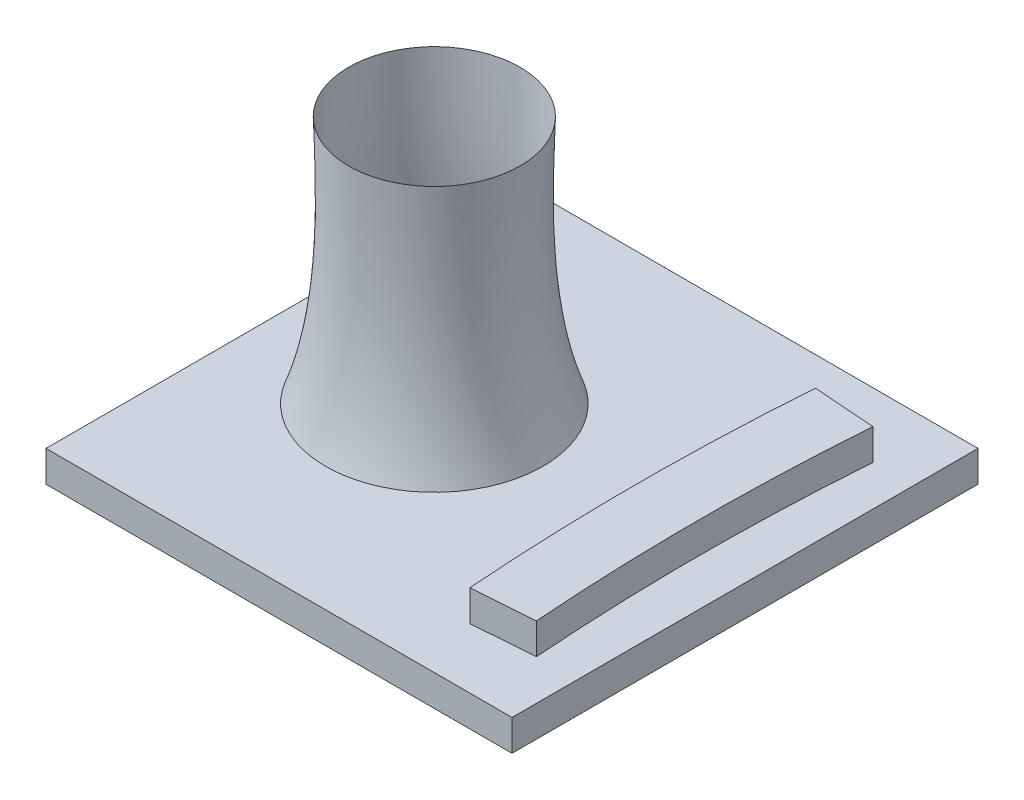
ISO-10303-21;
HEADER;
FILE_DESCRIPTION(('STEP AP214'),'2;1');
FILE_NAME('part.step','',(''),(''),'','','');
FILE_SCHEMA(('AUTOMOTIVE_DESIGN { 1 0 10303 214 1 1 1 1 }'));
ENDSEC;
DATA;
#1=APPLICATION_CONTEXT('core data for automotive mechanical design processes');
#2=APPLICATION_PROTOCOL_DEFINITION('international standard','automotive_design',2000,#1);
#3=PRODUCT_CONTEXT('',#1,'mechanical');
#4=PRODUCT('Part','Part','',(#3));
#5=PRODUCT_RELATED_PRODUCT_CATEGORY('part','',(#4));
#6=PRODUCT_DEFINITION_FORMATION('','',#4);
#7=PRODUCT_DEFINITION_CONTEXT('part definition',#1,'design');
#8=PRODUCT_DEFINITION('design','',#6,#7);
#9=PRODUCT_DEFINITION_SHAPE('','',#8);
#10=(LENGTH_UNIT() NAMED_UNIT(*) SI_UNIT(.MILLI.,.METRE.));
#11=(NAMED_UNIT(*) PLANE_ANGLE_UNIT() SI_UNIT($,.RADIAN.));
#12=(NAMED_UNIT(*) SI_UNIT($,.STERADIAN.) SOLID_ANGLE_UNIT());
#13=UNCERTAINTY_MEASURE_WITH_UNIT(LENGTH_MEASURE(1.E-05),#10,'distance_accuracy_value','');
#14=(GEOMETRIC_REPRESENTATION_CONTEXT(3) GLOBAL_UNCERTAINTY_ASSIGNED_CONTEXT((#13)) GLOBAL_UNIT_ASSIGNED_CONTEXT((#10,
#11,#12)) REPRESENTATION_CONTEXT('',''));
#15=CARTESIAN_POINT('',(0.,0.,0.));
#16=DIRECTION('',(0.,0.,1.));
#17=DIRECTION('',(1.,0.,0.));
#18=AXIS2_PLACEMENT_3D('',#15,#16,#17);
#19=CARTESIAN_POINT('',(50.,-10.,26.7834159771898));
#20=CARTESIAN_POINT('',(51.5360446831811,-3.89289577495572,34.0913470207165));
#21=CARTESIAN_POINT('',(52.5810938065248,25.4400049682429,48.805802062785));
#22=CARTESIAN_POINT('',(47.9107082583191,62.7737708917109,48.2171206091628));
#23=CARTESIAN_POINT('',(44.5619953627069,90.,47.9720763598593));
#24=CARTESIAN_POINT('',(46.844232146284,-10.,26.7834159771898));
#25=CARTESIAN_POINT('',(48.8585760484344,-3.89289579445962,33.9908139188959));
#26=CARTESIAN_POINT('',(50.8666940744463,25.440005003867,48.6368682931955));
#27=CARTESIAN_POINT('',(46.1577718719543,62.773770872207,48.3538662657232));
#28=CARTESIAN_POINT('',(42.7930220041651,90.,48.3279929095388));
#29=CARTESIAN_POINT('',(40.5327779805231,-10.,27.4048734473123));
#30=CARTESIAN_POINT('',(43.4839231096477,-3.89289848514892,34.3170065041225));
#31=CARTESIAN_POINT('',(47.4046507284485,25.4400099184445,48.6366061058294));
#32=CARTESIAN_POINT('',(42.6788817092925,62.7737681815177,48.9725332870656));
#33=CARTESIAN_POINT('',(39.3252176794973,89.9999999999998,49.3881643586702));
#34=CARTESIAN_POINT('',(31.4292845887339,-9.99999999999999,30.1664619918307));
#35=CARTESIAN_POINT('',(35.6722326883418,-3.89289967521169,36.3700416132635));
#36=CARTESIAN_POINT('',(42.31128798345,25.440012092109,49.6495922482934));
#37=CARTESIAN_POINT('',(37.7418559556166,62.7737669914551,50.9010063925906));
#38=CARTESIAN_POINT('',(34.5337190074696,90.0000000000004,51.962908963358));
#39=CARTESIAN_POINT('',(23.039558872965,-10.,34.6508586032685));
#40=CARTESIAN_POINT('',(28.4112154194457,-3.89289764991089,39.9074737062787));
#41=CARTESIAN_POINT('',(37.5133712534784,25.4400083928719,51.6366355915534));
#42=CARTESIAN_POINT('',(33.2758946890674,62.7737690167555,53.75546436725));
#43=CARTESIAN_POINT('',(30.3365779065963,89.9999999999994,55.4228446476357));
#44=CARTESIAN_POINT('',(15.6858666315459,-9.99999999999998,40.6858908945665));
#45=CARTESIAN_POINT('',(21.9798171690793,-3.89289959248465,44.7935686192731));
#46=CARTESIAN_POINT('',(33.1953171064472,25.440011941007,54.5216553999407));
#47=CARTESIAN_POINT('',(29.4526328783662,62.7737670741823,57.4264320282639));
#48=CARTESIAN_POINT('',(26.8950901608575,90.0000000000005,59.6351859938754));
#49=CARTESIAN_POINT('',(9.65085929320404,-10.,48.0395660532391));
#50=CARTESIAN_POINT('',(16.6252389719306,-3.89289737662122,50.8404080061829));
#51=CARTESIAN_POINT('',(29.5230823290591,25.4400078937049,58.1935137012388));
#52=CARTESIAN_POINT('',(26.4190017526858,62.7737692900451,61.7726775317442));
#53=CARTESIAN_POINT('',(24.3415034736129,89.9999999999995,64.4379703453799));
#54=CARTESIAN_POINT('',(5.16643584446719,-9.99999999999998,56.4293338688709));
#55=CARTESIAN_POINT('',(12.5532271274709,-3.89289829450224,57.8157278671272));
#56=CARTESIAN_POINT('',(26.6377721204681,25.440009570226,62.5113092205069));
#57=CARTESIAN_POINT('',(24.291593009661,62.7737683721646,66.6272767601216));
#58=CARTESIAN_POINT('',(22.7739846652669,90.0000000000004,69.6466572073446));
#59=CARTESIAN_POINT('',(2.40494429460202,-10.,65.5327535925535));
#60=CARTESIAN_POINT('',(9.92027166608392,-3.89289775499006,65.4514110555797));
#61=CARTESIAN_POINT('',(24.6502446204235,25.4400085848002,67.3089972929252));
#62=CARTESIAN_POINT('',(23.1521285611798,62.7737689116766,71.8035944731931));
#63=CARTESIAN_POINT('',(22.2527296379119,89.9999999999998,75.0610287192464));
#64=CARTESIAN_POINT('',(1.47250105450267,-10.,75.0000009005685));
#65=CARTESIAN_POINT('',(8.82755604516029,-3.89289815652996,73.4540511275151));
#66=CARTESIAN_POINT('',(23.636897460767,25.4400093182179,72.402263235385));
#67=CARTESIAN_POINT('',(23.0444191253954,62.7737685101369,77.1027640726562));
#68=CARTESIAN_POINT('',(22.7977956746769,90.0000000000002,80.473070318207));
#69=CARTESIAN_POINT('',(2.404944013433,-9.99999999999997,84.4672442491685));
#70=CARTESIAN_POINT('',(9.31707233897168,-3.89289781872243,81.5160976486671));
#71=CARTESIAN_POINT('',(23.6366582963666,25.4400087012083,77.5953566798255));
#72=CARTESIAN_POINT('',(23.9725843657939,62.7737688479441,82.3211253291737));
#73=CARTESIAN_POINT('',(24.3882120537142,89.9999999999999,85.6747857699478));
#74=CARTESIAN_POINT('',(5.16643651190207,-10.,93.5706694875571));
#75=CARTESIAN_POINT('',(11.3700109994957,-3.89289850136981,89.3277319043863));
#76=CARTESIAN_POINT('',(24.6495528352567,25.4400099480721,82.6886992730676));
#77=CARTESIAN_POINT('',(25.9009727694369,62.7737681652969,87.2581272068164));
#78=CARTESIAN_POINT('',(26.9628791668011,89.9999999999999,90.466262441197));
#79=CARTESIAN_POINT('',(9.65085799379323,-9.99999999999997,101.960428128512));
#80=CARTESIAN_POINT('',(14.9074717643047,-3.89289733438174,96.5887657423897));
#81=CARTESIAN_POINT('',(26.6366319656263,25.4400078165539,87.4866025735215));
#82=CARTESIAN_POINT('',(28.7554643548777,62.7737693322849,91.7240906755667));
#83=CARTESIAN_POINT('',(30.4228468796561,90.,94.6634155282791));
#84=CARTESIAN_POINT('',(15.6858690372599,-10.,109.314119531787));
#85=CARTESIAN_POINT('',(19.793518935168,-3.89289864126559,103.020135330356));
#86=CARTESIAN_POINT('',(29.5215692270281,25.4400102035937,91.8045916340506));
#87=CARTESIAN_POINT('',(32.4263939121902,62.773768025401,95.5473301269909));
#88=CARTESIAN_POINT('',(34.6351815027923,89.9999999999999,98.1049117267386));
#89=CARTESIAN_POINT('',(23.0395544345749,-9.99999999999998,115.349122310322));
#90=CARTESIAN_POINT('',(25.8403906665526,-3.89289706314234,108.374740760142));
#91=CARTESIAN_POINT('',(33.1934890830532,25.4400073211317,95.4768971403605));
#92=CARTESIAN_POINT('',(36.7726631789656,62.7737696035244,98.5809848030841));
#93=CARTESIAN_POINT('',(39.4379632031947,90.0000000000001,100.658488374736));
#94=CARTESIAN_POINT('',(31.4292933006047,-10.,119.833575607584));
#95=CARTESIAN_POINT('',(32.815699243417,-3.89290006293595,112.446774037515));
#96=CARTESIAN_POINT('',(37.5113027573094,25.4400128002923,98.3622114243815));
#97=CARTESIAN_POINT('',(41.6272621232999,62.7737666037306,100.708402536365));
#98=CARTESIAN_POINT('',(44.646637620429,89.9999999999999,102.226018355859));
#99=CARTESIAN_POINT('',(40.5327596344421,-9.99999999999997,122.595044920215));
#100=CARTESIAN_POINT('',(40.4514141183767,-3.89289670614299,115.079724537252));
#101=CARTESIAN_POINT('',(42.3089948318256,25.440006669068,100.349764161435));
#102=CARTESIAN_POINT('',(46.8035947380186,62.7737699605237,101.84787361086));
#103=CARTESIAN_POINT('',(50.0610305639051,90.0000000000001,102.747268530628));
#104=CARTESIAN_POINT('',(50.,-10.,123.527505943413));
#105=CARTESIAN_POINT('',(48.4540504348366,-3.89289891888131,116.172445498858));
#106=CARTESIAN_POINT('',(47.4022631077869,25.4400107106622,101.363094324242));
#107=CARTESIAN_POINT('',(52.1027636910204,62.7737677477855,101.955577954968));
#108=CARTESIAN_POINT('',(55.4730698842755,90.,102.202204627577));
#109=CARTESIAN_POINT('',(59.4672403655581,-9.99999999999998,122.595044920215));
#110=CARTESIAN_POINT('',(56.5160964047866,-3.89289680921488,115.682923569284));
#111=CARTESIAN_POINT('',(52.5953596775332,25.4400068573301,101.363350399451));
#112=CARTESIAN_POINT('',(57.3211258127139,62.7737698574517,101.027418011497));
#113=CARTESIAN_POINT('',(60.6747844774491,90.,100.611786583534));
#114=CARTESIAN_POINT('',(68.5707066993954,-10.,119.833575607584));
#115=CARTESIAN_POINT('',(64.3277579651942,-3.89290014616978,113.629992501524));
#116=CARTESIAN_POINT('',(57.6887053262633,25.4400129523198,100.350433631502));
#117=CARTESIAN_POINT('',(62.2581400886502,62.7737665204972,99.0990199682804));
#118=CARTESIAN_POINT('',(65.4662798845794,90.0000000000003,98.037116807718));
#119=CARTESIAN_POINT('',(76.960445565425,-9.99999999999997,115.349122310322));
#120=CARTESIAN_POINT('',(71.5887892917945,-3.89289748405628,110.092508773163));
#121=CARTESIAN_POINT('',(62.4866325360016,25.4400080899364,98.3633503714723));
#122=CARTESIAN_POINT('',(66.7241073771749,62.7737691826102,96.2445213217684));
#123=CARTESIAN_POINT('',(69.6634226934954,89.9999999999997,94.577141133231));
#124=CARTESIAN_POINT('',(84.3141309627403,-10.,109.314119531786));
#125=CARTESIAN_POINT('',(78.0201806272083,-3.89289974812967,105.206439793423));
#126=CARTESIAN_POINT('',(66.8046814923628,25.4400122252946,95.4783494646189));
#127=CARTESIAN_POINT('',(70.5473663371014,62.7737669185372,92.5735746416984));
#128=CARTESIAN_POINT('',(73.1049095275809,90.0000000000003,90.3648218041995));
#129=CARTESIAN_POINT('',(90.3491420062064,-9.99999999999996,101.960428128513));
#130=CARTESIAN_POINT('',(83.3747621835483,-3.89289730195224,99.1595874071178));
#131=CARTESIAN_POINT('',(70.4769183795616,25.440007757321,91.8064838728521));
#132=CARTESIAN_POINT('',(73.5809986180815,62.7737693647143,88.2273190235765));
#133=CARTESIAN_POINT('',(75.6584966580028,89.9999999999999,85.5620255531993));
#134=CARTESIAN_POINT('',(94.8335634880985,-10.0000000000001,93.570669487557));
#135=CARTESIAN_POINT('',(87.4467722724628,-3.89289832248762,92.1842747915974));
#136=CARTESIAN_POINT('',(73.3622275046518,25.4400096213416,87.488692137968));
#137=CARTESIAN_POINT('',(75.7084068283874,62.773768344179,83.3727249576722));
#138=CARTESIAN_POINT('',(77.2260153219984,89.9999999999999,80.3533447366744));
#139=CARTESIAN_POINT('',(97.5950559865664,-9.99999999999995,84.4672442491686));
#140=CARTESIAN_POINT('',(90.0797286076632,-3.8928977458714,84.5485872308226));
#141=CARTESIAN_POINT('',(75.3497555721623,25.440008568145,82.6910018312185));
#142=CARTESIAN_POINT('',(76.8478714747875,62.7737689207953,78.1964044653809));
#143=CARTESIAN_POINT('',(77.7472702872052,90.0000000000001,74.9389701009866));
#144=CARTESIAN_POINT('',(98.5274989454977,-10.0000000000001,75.0000009005688));
#145=CARTESIAN_POINT('',(91.1724439032431,-3.89289815799269,76.545950308323));
#146=CARTESIAN_POINT('',(76.3631024536139,25.4400093208895,77.5977375059417));
#147=CARTESIAN_POINT('',(76.9555809505671,62.773768508674,72.8972367964183));
#148=CARTESIAN_POINT('',(77.2022045166622,90.,69.5269306327849));
#149=CARTESIAN_POINT('',(97.5950557053978,-9.99999999999997,65.5327535925535));
#150=CARTESIAN_POINT('',(90.6829275114112,-3.89289782411876,68.483900623601));
#151=CARTESIAN_POINT('',(76.3633417158851,25.4400087110649,72.4046424182934));
#152=CARTESIAN_POINT('',(76.0274154143068,62.7737688425477,67.6788736374973));
#153=CARTESIAN_POINT('',(75.6117875590751,89.9999999999999,64.3252131131251));
#154=CARTESIAN_POINT('',(94.8335641555333,-10.,56.4293338688712));
#155=CARTESIAN_POINT('',(88.6299894042075,-3.89289848073982,60.6722707872873));
#156=CARTESIAN_POINT('',(75.3504472224857,25.4400099103911,67.3113021493428));
#157=CARTESIAN_POINT('',(74.0990276967141,62.773768185927,62.7418744384469));
#158=CARTESIAN_POINT('',(73.0371215967787,90.0000000000002,59.5337393466285));
#159=CARTESIAN_POINT('',(90.3491407067958,-10.,48.0395660532392));
#160=CARTESIAN_POINT('',(85.0925274429175,-3.89289738357706,53.4112296054721));
#161=CARTESIAN_POINT('',(73.3633678734158,25.4400079064099,62.513394869176));
#162=CARTESIAN_POINT('',(71.2445345864195,62.7737692830894,58.2759060660736));
#163=CARTESIAN_POINT('',(69.5771514127728,89.9999999999998,55.3365807403427));
#164=CARTESIAN_POINT('',(84.3141333684543,-10.,40.6858908945666));
#165=CARTESIAN_POINT('',(80.2064825811949,-3.89289853040258,46.9798732040335));
#166=CARTESIAN_POINT('',(70.478431153,25.4400100011008,58.1954134977783));
#167=CARTESIAN_POINT('',(67.5736081793982,62.7737681362642,54.4526761609073));
#168=CARTESIAN_POINT('',(65.3648218003779,90.0000000000001,51.8950953440544));
#169=CARTESIAN_POINT('',(76.9604411270351,-9.99999999999999,34.6508586032685));
#170=CARTESIAN_POINT('',(74.1596060967756,-3.89289722323844,41.6252414541534));
#171=CARTESIAN_POINT('',(66.8065094920364,25.4400076135494,54.523088207768));
#172=CARTESIAN_POINT('',(63.2273325943886,62.7737694434282,51.4190015836739));
#173=CARTESIAN_POINT('',(60.5620307442557,89.9999999999999,49.3414987446389));
#174=CARTESIAN_POINT('',(68.5707154112661,-10.,30.1664619918307));
#175=CARTESIAN_POINT('',(67.1843073030505,-3.89289958714321,37.5532604849489));
#176=CARTESIAN_POINT('',(62.4886994379756,25.4400119312507,51.637815820798));
#177=CARTESIAN_POINT('',(58.3727456194864,62.7737670795235,49.2916223463608));
#178=CARTESIAN_POINT('',(55.3533733680963,90.0000000000002,47.7740049814119));
#179=CARTESIAN_POINT('',(59.4672220194768,-10.,27.4048734473122));
#180=CARTESIAN_POINT('',(59.5485718347857,-3.89289836812552,34.9202051150464));
#181=CARTESIAN_POINT('',(57.6910033022145,25.4400097046999,49.6501889795312));
#182=CARTESIAN_POINT('',(53.1963906709522,62.7737682985411,48.1520813501818));
#183=CARTESIAN_POINT('',(49.9389484742196,89.9999999999999,47.2526870630719));
#184=CARTESIAN_POINT('',(53.155767853716,-10.,26.7834159771898));
#185=CARTESIAN_POINT('',(54.2135133179278,-3.89289575545182,34.1918801225372));
#186=CARTESIAN_POINT('',(54.2954935386032,25.4400049326188,48.9747358323746));
#187=CARTESIAN_POINT('',(49.6636446446838,62.7737709112148,48.0803749526024));
#188=CARTESIAN_POINT('',(46.3309687212488,90.,47.6161598101799));
#189=CARTESIAN_POINT('',(50.,-10.,26.7834159771898));
#190=CARTESIAN_POINT('',(51.5360446831811,-3.89289577495572,34.0913470207165));
#191=CARTESIAN_POINT('',(52.5810938065248,25.4400049682429,48.805802062785));
#192=CARTESIAN_POINT('',(47.9107082583191,62.7737708917109,48.2171206091628));
#193=CARTESIAN_POINT('',(44.5619953627069,90.,47.9720763598593));
#194=B_SPLINE_SURFACE_WITH_KNOTS('',3,3,((#19,#20,#21,#22,#23),(#24,#25,#26,#27,#28),(#29,#30,
#31,#32,#33),(#34,#35,#36,#37,#38),(#39,#40,#41,#42,#43),(#44,#45,#46,#47,#48),(#49,#50,#51,#52,
#53),(#54,#55,#56,#57,#58),(#59,#60,#61,#62,#63),(#64,#65,#66,#67,#68),(#69,#70,#71,#72,#73),
(#74,#75,#76,#77,#78),(#79,#80,#81,#82,#83),(#84,#85,#86,#87,#88),(#89,#90,#91,#92,#93),(#94,
#95,#96,#97,#98),(#99,#100,#101,#102,#103),(#104,#105,#106,#107,#108),(#109,#110,#111,#112,
#113),(#114,#115,#116,#117,#118),(#119,#120,#121,#122,#123),(#124,#125,#126,#127,#128),(#129,
#130,#131,#132,#133),(#134,#135,#136,#137,#138),(#139,#140,#141,#142,#143),(#144,#145,#146,#147,
#148),(#149,#150,#151,#152,#153),(#154,#155,#156,#157,#158),(#159,#160,#161,#162,#163),(#164,
#165,#166,#167,#168),(#169,#170,#171,#172,#173),(#174,#175,#176,#177,#178),(#179,#180,#181,#182,
#183),(#184,#185,#186,#187,#188),(#189,#190,#191,#192,#193)),.UNSPECIFIED.,.T.,.F.,.F.,(4,1,1,1,
1,1,1,1,1,1,1,1,1,1,1,1,1,1,1,1,1,1,1,1,1,1,1,1,1,1,1,1,4),(4,1,4),(0.,0.03125,0.0625,0.09375,
0.125,0.15625,0.1875,0.21875,0.25,0.28125,0.3125,0.34375,0.375,0.40625,0.4375,0.46875,0.5,
0.53125,0.5625,0.59375,0.625,0.65625,0.6875,0.71875,0.75,0.78125,0.8125,0.84375,0.875,0.90625,
0.9375,0.96875,1.),(0.,0.229623305502749,1.),.UNSPECIFIED.);
#195=CARTESIAN_POINT('',(50.,-10.,26.7834159771898));
#196=CARTESIAN_POINT('',(46.844232146284,-10.,26.7834159771898));
#197=CARTESIAN_POINT('',(40.5327779805231,-10.,27.4048734473123));
#198=CARTESIAN_POINT('',(31.4292845887339,-9.99999999999999,30.1664619918307));
#199=CARTESIAN_POINT('',(23.039558872965,-10.,34.6508586032685));
#200=CARTESIAN_POINT('',(15.6858666315459,-9.99999999999998,40.6858908945665));
#201=CARTESIAN_POINT('',(9.65085929320404,-10.,48.0395660532391));
#202=CARTESIAN_POINT('',(5.16643584446719,-9.99999999999998,56.4293338688709));
#203=CARTESIAN_POINT('',(2.40494429460202,-10.,65.5327535925535));
#204=CARTESIAN_POINT('',(1.47250105450267,-10.,75.0000009005685));
#205=CARTESIAN_POINT('',(2.404944013433,-9.99999999999997,84.4672442491685));
#206=CARTESIAN_POINT('',(5.16643651190207,-10.,93.5706694875571));
#207=CARTESIAN_POINT('',(9.65085799379323,-9.99999999999997,101.960428128512));
#208=CARTESIAN_POINT('',(15.6858690372599,-10.,109.314119531787));
#209=CARTESIAN_POINT('',(23.0395544345749,-9.99999999999998,115.349122310322));
#210=CARTESIAN_POINT('',(31.4292933006047,-10.,119.833575607584));
#211=CARTESIAN_POINT('',(40.5327596344421,-9.99999999999997,122.595044920215));
#212=CARTESIAN_POINT('',(50.,-10.,123.527505943413));
#213=CARTESIAN_POINT('',(59.4672403655581,-9.99999999999998,122.595044920215));
#214=CARTESIAN_POINT('',(68.5707066993954,-10.,119.833575607584));
#215=CARTESIAN_POINT('',(76.960445565425,-9.99999999999997,115.349122310322));
#216=CARTESIAN_POINT('',(84.3141309627403,-10.,109.314119531786));
#217=CARTESIAN_POINT('',(90.3491420062064,-9.99999999999996,101.960428128513));
#218=CARTESIAN_POINT('',(94.8335634880985,-10.0000000000001,93.570669487557));
#219=CARTESIAN_POINT('',(97.5950559865664,-9.99999999999995,84.4672442491686));
#220=CARTESIAN_POINT('',(98.5274989454977,-10.0000000000001,75.0000009005688));
#221=CARTESIAN_POINT('',(97.5950557053978,-9.99999999999997,65.5327535925535));
#222=CARTESIAN_POINT('',(94.8335641555333,-10.,56.4293338688712));
#223=CARTESIAN_POINT('',(90.3491407067958,-10.,48.0395660532392));
#224=CARTESIAN_POINT('',(84.3141333684543,-10.,40.6858908945666));
#225=CARTESIAN_POINT('',(76.9604411270351,-9.99999999999999,34.6508586032685));
#226=CARTESIAN_POINT('',(68.5707154112661,-10.,30.1664619918307));
#227=CARTESIAN_POINT('',(59.4672220194768,-10.,27.4048734473122));
#228=CARTESIAN_POINT('',(53.155767853716,-10.,26.7834159771898));
#229=CARTESIAN_POINT('',(50.,-10.,26.7834159771898));
#230=B_SPLINE_CURVE_WITH_KNOTS('',3,(#195,#196,#197,#198,#199,#200,#201,#202,#203,#204,#205,
#206,#207,#208,#209,#210,#211,#212,#213,#214,#215,#216,#217,#218,#219,#220,#221,#222,#223,#224,
#225,#226,#227,#228,#229),.UNSPECIFIED.,.T.,.F.,(4,1,1,1,1,1,1,1,1,1,1,1,1,1,1,1,1,1,1,1,1,1,1,
1,1,1,1,1,1,1,1,1,4),(0.,0.03125,0.0625,0.09375,0.125,0.15625,0.1875,0.21875,0.25,0.28125,
0.3125,0.34375,0.375,0.40625,0.4375,0.46875,0.5,0.53125,0.5625,0.59375,0.625,0.65625,0.6875,
0.71875,0.75,0.78125,0.8125,0.84375,0.875,0.90625,0.9375,0.96875,1.),.UNSPECIFIED.);
#231=CARTESIAN_POINT('',(50.,-10.,26.7834159771898));
#232=VERTEX_POINT('',#231);
#233=EDGE_CURVE('E12',#232,#232,#230,.T.);
#234=CARTESIAN_POINT('',(44.5619953627069,90.,47.9720763598593));
#235=CARTESIAN_POINT('',(42.7930220041651,90.,48.3279929095388));
#236=CARTESIAN_POINT('',(39.3252176794973,89.9999999999998,49.3881643586702));
#237=CARTESIAN_POINT('',(34.5337190074696,90.0000000000004,51.962908963358));
#238=CARTESIAN_POINT('',(30.3365779065963,89.9999999999994,55.4228446476357));
#239=CARTESIAN_POINT('',(26.8950901608575,90.0000000000005,59.6351859938754));
#240=CARTESIAN_POINT('',(24.3415034736129,89.9999999999995,64.4379703453799));
#241=CARTESIAN_POINT('',(22.7739846652669,90.0000000000004,69.6466572073446));
#242=CARTESIAN_POINT('',(22.2527296379119,89.9999999999998,75.0610287192464));
#243=CARTESIAN_POINT('',(22.7977956746769,90.0000000000002,80.473070318207));
#244=CARTESIAN_POINT('',(24.3882120537142,89.9999999999999,85.6747857699478));
#245=CARTESIAN_POINT('',(26.9628791668011,89.9999999999999,90.466262441197));
#246=CARTESIAN_POINT('',(30.4228468796561,90.,94.6634155282791));
#247=CARTESIAN_POINT('',(34.6351815027923,89.9999999999999,98.1049117267386));
#248=CARTESIAN_POINT('',(39.4379632031947,90.0000000000001,100.658488374736));
#249=CARTESIAN_POINT('',(44.646637620429,89.9999999999999,102.226018355859));
#250=CARTESIAN_POINT('',(50.0610305639051,90.0000000000001,102.747268530628));
#251=CARTESIAN_POINT('',(55.4730698842755,90.,102.202204627577));
#252=CARTESIAN_POINT('',(60.6747844774491,90.,100.611786583534));
#253=CARTESIAN_POINT('',(65.4662798845794,90.0000000000003,98.037116807718));
#254=CARTESIAN_POINT('',(69.6634226934954,89.9999999999997,94.577141133231));
#255=CARTESIAN_POINT('',(73.1049095275809,90.0000000000003,90.3648218041995));
#256=CARTESIAN_POINT('',(75.6584966580028,89.9999999999999,85.5620255531993));
#257=CARTESIAN_POINT('',(77.2260153219984,89.9999999999999,80.3533447366744));
#258=CARTESIAN_POINT('',(77.7472702872052,90.0000000000001,74.9389701009866));
#259=CARTESIAN_POINT('',(77.2022045166622,90.,69.5269306327849));
#260=CARTESIAN_POINT('',(75.6117875590751,89.9999999999999,64.3252131131251));
#261=CARTESIAN_POINT('',(73.0371215967787,90.0000000000002,59.5337393466285));
#262=CARTESIAN_POINT('',(69.5771514127728,89.9999999999998,55.3365807403427));
#263=CARTESIAN_POINT('',(65.3648218003779,90.0000000000001,51.8950953440544));
#264=CARTESIAN_POINT('',(60.5620307442557,89.9999999999999,49.3414987446389));
#265=CARTESIAN_POINT('',(55.3533733680963,90.0000000000002,47.7740049814119));
#266=CARTESIAN_POINT('',(49.9389484742196,89.9999999999999,47.2526870630719));
#267=CARTESIAN_POINT('',(46.3309687212488,90.,47.6161598101799));
#268=CARTESIAN_POINT('',(44.5619953627069,90.,47.9720763598593));
#269=B_SPLINE_CURVE_WITH_KNOTS('',3,(#234,#235,#236,#237,#238,#239,#240,#241,#242,#243,#244,
#245,#246,#247,#248,#249,#250,#251,#252,#253,#254,#255,#256,#257,#258,#259,#260,#261,#262,#263,
#264,#265,#266,#267,#268),.UNSPECIFIED.,.T.,.F.,(4,1,1,1,1,1,1,1,1,1,1,1,1,1,1,1,1,1,1,1,1,1,1,
1,1,1,1,1,1,1,1,1,4),(0.,0.03125,0.0625,0.09375,0.125,0.15625,0.1875,0.21875,0.25,0.28125,
0.3125,0.34375,0.375,0.40625,0.4375,0.46875,0.5,0.53125,0.5625,0.59375,0.625,0.65625,0.6875,
0.71875,0.75,0.78125,0.8125,0.84375,0.875,0.90625,0.9375,0.96875,1.),.UNSPECIFIED.);
#270=CARTESIAN_POINT('',(44.5619953627069,90.,47.9720763598593));
#271=VERTEX_POINT('',#270);
#272=EDGE_CURVE('E111',#271,#271,#269,.F.);
#273=ORIENTED_EDGE('',*,*,#233,.T.);
#274=EDGE_LOOP('',(#273));
#275=FACE_BOUND('',#274,.T.);
#276=ORIENTED_EDGE('',*,*,#272,.T.);
#277=EDGE_LOOP('',(#276));
#278=FACE_BOUND('',#277,.T.);
#279=ADVANCED_FACE('F108',(#275,#278),#194,.T.);
#280=OPEN_SHELL('',(#279));
#281=SHELL_BASED_SURFACE_MODEL('B2',(#280));
#282=CARTESIAN_POINT('',(0.,10.,0.));
#283=DIRECTION('',(0.,1.,0.));
#284=DIRECTION('',(0.,0.,1.));
#285=AXIS2_PLACEMENT_3D('',#282,#283,#284);
#286=PLANE('',#285);
#287=DIRECTION('',(0.,0.,1.));
#288=VECTOR('',#287,1.);
#289=CARTESIAN_POINT('',(0.,10.,0.));
#290=LINE('',#289,#288);
#291=CARTESIAN_POINT('',(0.,10.,0.));
#292=VERTEX_POINT('',#291);
#293=CARTESIAN_POINT('',(0.,10.,150.));
#294=VERTEX_POINT('',#293);
#295=EDGE_CURVE('E260',#292,#294,#290,.T.);
#296=ORIENTED_EDGE('',*,*,#295,.T.);
#297=DIRECTION('',(1.,0.,0.));
#298=VECTOR('',#297,1.);
#299=CARTESIAN_POINT('',(0.,10.,150.));
#300=LINE('',#299,#298);
#301=CARTESIAN_POINT('',(150.,10.,150.));
#302=VERTEX_POINT('',#301);
#303=EDGE_CURVE('E202',#294,#302,#300,.T.);
#304=ORIENTED_EDGE('',*,*,#303,.T.);
#305=DIRECTION('',(0.,0.,-1.));
#306=VECTOR('',#305,1.);
#307=CARTESIAN_POINT('',(150.,10.,0.));
#308=LINE('',#307,#306);
#309=CARTESIAN_POINT('',(150.,10.,0.));
#310=VERTEX_POINT('',#309);
#311=EDGE_CURVE('E263',#302,#310,#308,.T.);
#312=ORIENTED_EDGE('',*,*,#311,.T.);
#313=DIRECTION('',(-1.,0.,0.));
#314=VECTOR('',#313,1.);
#315=CARTESIAN_POINT('',(0.,10.,0.));
#316=LINE('',#315,#314);
#317=EDGE_CURVE('E174',#310,#292,#316,.T.);
#318=ORIENTED_EDGE('',*,*,#317,.T.);
#319=EDGE_LOOP('',(#296,#304,#312,#318));
#320=FACE_BOUND('',#319,.T.);
#321=CARTESIAN_POINT('',(50.,10.,75.));
#322=DIRECTION('',(0.,1.,0.));
#323=DIRECTION('',(0.,0.,1.));
#324=AXIS2_PLACEMENT_3D('',#321,#322,#323);
#325=CIRCLE('',#324,35.);
#326=CARTESIAN_POINT('',(50.,10.,110.));
#327=VERTEX_POINT('',#326);
#328=EDGE_CURVE('E252',#327,#327,#325,.T.);
#329=ORIENTED_EDGE('',*,*,#328,.F.);
#330=EDGE_LOOP('',(#329));
#331=FACE_BOUND('',#330,.T.);
#332=DIRECTION('',(0.997245813189047,0.,-0.074167297894127));
#333=VECTOR('',#332,1.);
#334=CARTESIAN_POINT('',(117.065640108216,10.,130.625473420607));
#335=LINE('',#334,#333);
#336=CARTESIAN_POINT('',(117.065640108216,10.,130.625473420607));
#337=VERTEX_POINT('',#336);
#338=CARTESIAN_POINT('',(137.010556371996,10.,129.142127462724));
#339=VERTEX_POINT('',#338);
#340=EDGE_CURVE('E398',#337,#339,#335,.T.);
#341=ORIENTED_EDGE('',*,*,#340,.F.);
#342=CARTESIAN_POINT('',(865.,10.,75.));
#343=DIRECTION('',(0.,1.,0.));
#344=DIRECTION('',(0.,0.,1.));
#345=AXIS2_PLACEMENT_3D('',#342,#343,#344);
#346=CIRCLE('',#345,750.);
#347=CARTESIAN_POINT('',(117.065640108216,10.,19.3745265793927));
#348=VERTEX_POINT('',#347);
#349=EDGE_CURVE('E247',#348,#337,#346,.T.);
#350=ORIENTED_EDGE('',*,*,#349,.F.);
#351=DIRECTION('',(-0.997245813189047,0.,-0.0741672978941285));
#352=VECTOR('',#351,1.);
#353=CARTESIAN_POINT('',(117.065640108216,10.,19.3745265793927));
#354=LINE('',#353,#352);
#355=CARTESIAN_POINT('',(137.010556371997,10.,20.8578725372753));
#356=VERTEX_POINT('',#355);
#357=EDGE_CURVE('E243',#356,#348,#354,.T.);
#358=ORIENTED_EDGE('',*,*,#357,.F.);
#359=CARTESIAN_POINT('',(865.,10.,75.));
#360=DIRECTION('',(0.,-1.,0.));
#361=DIRECTION('',(0.,0.,1.));
#362=AXIS2_PLACEMENT_3D('',#359,#360,#361);
#363=CIRCLE('',#362,730.);
#364=EDGE_CURVE('E395',#339,#356,#363,.T.);
#365=ORIENTED_EDGE('',*,*,#364,.F.);
#366=EDGE_LOOP('',(#341,#350,#358,#365));
#367=FACE_BOUND('',#366,.T.);
#368=ADVANCED_FACE('F150',(#320,#331,#367),#286,.T.);
#369=CARTESIAN_POINT('',(0.,0.,0.));
#370=DIRECTION('',(0.,1.,0.));
#371=DIRECTION('',(0.,0.,1.));
#372=AXIS2_PLACEMENT_3D('',#369,#370,#371);
#373=PLANE('',#372);
#374=DIRECTION('',(0.,0.,1.));
#375=VECTOR('',#374,1.);
#376=CARTESIAN_POINT('',(0.,0.,0.));
#377=LINE('',#376,#375);
#378=CARTESIAN_POINT('',(0.,0.,0.));
#379=VERTEX_POINT('',#378);
#380=CARTESIAN_POINT('',(0.,0.,150.));
#381=VERTEX_POINT('',#380);
#382=EDGE_CURVE('E258',#379,#381,#377,.T.);
#383=ORIENTED_EDGE('',*,*,#382,.F.);
#384=DIRECTION('',(-1.,0.,0.));
#385=VECTOR('',#384,1.);
#386=CARTESIAN_POINT('',(0.,0.,0.));
#387=LINE('',#386,#385);
#388=CARTESIAN_POINT('',(150.,0.,0.));
#389=VERTEX_POINT('',#388);
#390=EDGE_CURVE('E195',#389,#379,#387,.T.);
#391=ORIENTED_EDGE('',*,*,#390,.F.);
#392=DIRECTION('',(0.,0.,-1.));
#393=VECTOR('',#392,1.);
#394=CARTESIAN_POINT('',(150.,0.,0.));
#395=LINE('',#394,#393);
#396=CARTESIAN_POINT('',(150.,0.,150.));
#397=VERTEX_POINT('',#396);
#398=EDGE_CURVE('E271',#397,#389,#395,.T.);
#399=ORIENTED_EDGE('',*,*,#398,.F.);
#400=DIRECTION('',(1.,0.,0.));
#401=VECTOR('',#400,1.);
#402=CARTESIAN_POINT('',(0.,0.,150.));
#403=LINE('',#402,#401);
#404=EDGE_CURVE('E269',#381,#397,#403,.T.);
#405=ORIENTED_EDGE('',*,*,#404,.F.);
#406=EDGE_LOOP('',(#383,#391,#399,#405));
#407=FACE_BOUND('',#406,.T.);
#408=CARTESIAN_POINT('',(50.,0.,75.));
#409=DIRECTION('',(0.,1.,0.));
#410=DIRECTION('',(0.,0.,1.));
#411=AXIS2_PLACEMENT_3D('',#408,#409,#410);
#412=CIRCLE('',#411,35.);
#413=CARTESIAN_POINT('',(50.,0.,110.));
#414=VERTEX_POINT('',#413);
#415=EDGE_CURVE('E249',#414,#414,#412,.T.);
#416=ORIENTED_EDGE('',*,*,#415,.T.);
#417=EDGE_LOOP('',(#416));
#418=FACE_BOUND('',#417,.T.);
#419=ADVANCED_FACE('F284',(#407,#418),#373,.F.);
#420=CARTESIAN_POINT('',(0.,10.,0.));
#421=DIRECTION('',(1.,0.,0.));
#422=DIRECTION('',(0.,0.,-1.));
#423=AXIS2_PLACEMENT_3D('',#420,#421,#422);
#424=PLANE('',#423);
#425=ORIENTED_EDGE('',*,*,#382,.T.);
#426=DIRECTION('',(0.,-1.,0.));
#427=VECTOR('',#426,1.);
#428=CARTESIAN_POINT('',(0.,10.,150.));
#429=LINE('',#428,#427);
#430=EDGE_CURVE('E106',#294,#381,#429,.T.);
#431=ORIENTED_EDGE('',*,*,#430,.F.);
#432=ORIENTED_EDGE('',*,*,#295,.F.);
#433=DIRECTION('',(0.,-1.,0.));
#434=VECTOR('',#433,1.);
#435=CARTESIAN_POINT('',(0.,10.,0.));
#436=LINE('',#435,#434);
#437=EDGE_CURVE('E266',#292,#379,#436,.T.);
#438=ORIENTED_EDGE('',*,*,#437,.T.);
#439=EDGE_LOOP('',(#425,#431,#432,#438));
#440=FACE_BOUND('',#439,.T.);
#441=ADVANCED_FACE('F152',(#440),#424,.F.);
#442=CARTESIAN_POINT('',(0.,10.,150.));
#443=DIRECTION('',(0.,0.,-1.));
#444=DIRECTION('',(-1.,0.,0.));
#445=AXIS2_PLACEMENT_3D('',#442,#443,#444);
#446=PLANE('',#445);
#447=ORIENTED_EDGE('',*,*,#404,.T.);
#448=DIRECTION('',(0.,-1.,0.));
#449=VECTOR('',#448,1.);
#450=CARTESIAN_POINT('',(150.,10.,150.));
#451=LINE('',#450,#449);
#452=EDGE_CURVE('E158',#302,#397,#451,.T.);
#453=ORIENTED_EDGE('',*,*,#452,.F.);
#454=ORIENTED_EDGE('',*,*,#303,.F.);
#455=ORIENTED_EDGE('',*,*,#430,.T.);
#456=EDGE_LOOP('',(#447,#453,#454,#455));
#457=FACE_BOUND('',#456,.T.);
#458=ADVANCED_FACE('F299',(#457),#446,.F.);
#459=CARTESIAN_POINT('',(150.,10.,0.));
#460=DIRECTION('',(-1.,0.,0.));
#461=DIRECTION('',(0.,0.,1.));
#462=AXIS2_PLACEMENT_3D('',#459,#460,#461);
#463=PLANE('',#462);
#464=ORIENTED_EDGE('',*,*,#398,.T.);
#465=DIRECTION('',(0.,-1.,0.));
#466=VECTOR('',#465,1.);
#467=CARTESIAN_POINT('',(150.,10.,0.));
#468=LINE('',#467,#466);
#469=EDGE_CURVE('E275',#310,#389,#468,.T.);
#470=ORIENTED_EDGE('',*,*,#469,.F.);
#471=ORIENTED_EDGE('',*,*,#311,.F.);
#472=ORIENTED_EDGE('',*,*,#452,.T.);
#473=EDGE_LOOP('',(#464,#470,#471,#472));
#474=FACE_BOUND('',#473,.T.);
#475=ADVANCED_FACE('F280',(#474),#463,.F.);
#476=CARTESIAN_POINT('',(0.,10.,0.));
#477=DIRECTION('',(0.,0.,1.));
#478=DIRECTION('',(1.,0.,0.));
#479=AXIS2_PLACEMENT_3D('',#476,#477,#478);
#480=PLANE('',#479);
#481=ORIENTED_EDGE('',*,*,#390,.T.);
#482=ORIENTED_EDGE('',*,*,#437,.F.);
#483=ORIENTED_EDGE('',*,*,#317,.F.);
#484=ORIENTED_EDGE('',*,*,#469,.T.);
#485=EDGE_LOOP('',(#481,#482,#483,#484));
#486=FACE_BOUND('',#485,.T.);
#487=ADVANCED_FACE('F289',(#486),#480,.F.);
#488=CARTESIAN_POINT('',(50.,10.,75.));
#489=DIRECTION('',(0.,-1.,0.));
#490=DIRECTION('',(0.,0.,-1.));
#491=AXIS2_PLACEMENT_3D('',#488,#489,#490);
#492=CYLINDRICAL_SURFACE('',#491,35.);
#493=ORIENTED_EDGE('',*,*,#328,.T.);
#494=EDGE_LOOP('',(#493));
#495=FACE_BOUND('',#494,.T.);
#496=ORIENTED_EDGE('',*,*,#415,.F.);
#497=EDGE_LOOP('',(#496));
#498=FACE_BOUND('',#497,.T.);
#499=ADVANCED_FACE('F291',(#495,#498),#492,.F.);
#500=CARTESIAN_POINT('',(865.,20.,75.));
#501=DIRECTION('',(0.,-1.,0.));
#502=DIRECTION('',(0.,0.,-1.));
#503=AXIS2_PLACEMENT_3D('',#500,#501,#502);
#504=CYLINDRICAL_SURFACE('',#503,750.);
#505=ORIENTED_EDGE('',*,*,#349,.T.);
#506=DIRECTION('',(0.,-1.,0.));
#507=VECTOR('',#506,1.);
#508=CARTESIAN_POINT('',(117.065640108216,20.,130.625473420607));
#509=LINE('',#508,#507);
#510=CARTESIAN_POINT('',(117.065640108216,20.,130.625473420607));
#511=VERTEX_POINT('',#510);
#512=EDGE_CURVE('E228',#511,#337,#509,.T.);
#513=ORIENTED_EDGE('',*,*,#512,.F.);
#514=CARTESIAN_POINT('',(865.,20.,75.));
#515=DIRECTION('',(0.,1.,0.));
#516=DIRECTION('',(0.,0.,1.));
#517=AXIS2_PLACEMENT_3D('',#514,#515,#516);
#518=CIRCLE('',#517,750.);
#519=CARTESIAN_POINT('',(117.065640108216,20.,19.3745265793927));
#520=VERTEX_POINT('',#519);
#521=EDGE_CURVE('E235',#520,#511,#518,.T.);
#522=ORIENTED_EDGE('',*,*,#521,.F.);
#523=DIRECTION('',(0.,-1.,0.));
#524=VECTOR('',#523,1.);
#525=CARTESIAN_POINT('',(117.065640108216,20.,19.3745265793927));
#526=LINE('',#525,#524);
#527=EDGE_CURVE('E392',#520,#348,#526,.T.);
#528=ORIENTED_EDGE('',*,*,#527,.T.);
#529=EDGE_LOOP('',(#505,#513,#522,#528));
#530=FACE_BOUND('',#529,.T.);
#531=ADVANCED_FACE('F245',(#530),#504,.T.);
#532=CARTESIAN_POINT('',(117.065640108216,20.,130.625473420607));
#533=DIRECTION('',(-0.074167297894127,0.,-0.997245813189047));
#534=DIRECTION('',(-0.997245813189047,0.,0.074167297894127));
#535=AXIS2_PLACEMENT_3D('',#532,#533,#534);
#536=PLANE('',#535);
#537=ORIENTED_EDGE('',*,*,#340,.T.);
#538=DIRECTION('',(0.,-1.,0.));
#539=VECTOR('',#538,1.);
#540=CARTESIAN_POINT('',(137.010556371996,20.,129.142127462724));
#541=LINE('',#540,#539);
#542=CARTESIAN_POINT('',(137.010556371996,20.,129.142127462724));
#543=VERTEX_POINT('',#542);
#544=EDGE_CURVE('E231',#543,#339,#541,.T.);
#545=ORIENTED_EDGE('',*,*,#544,.F.);
#546=DIRECTION('',(0.997245813189047,0.,-0.074167297894127));
#547=VECTOR('',#546,1.);
#548=CARTESIAN_POINT('',(117.065640108216,20.,130.625473420607));
#549=LINE('',#548,#547);
#550=EDGE_CURVE('E224',#511,#543,#549,.T.);
#551=ORIENTED_EDGE('',*,*,#550,.F.);
#552=ORIENTED_EDGE('',*,*,#512,.T.);
#553=EDGE_LOOP('',(#537,#545,#551,#552));
#554=FACE_BOUND('',#553,.T.);
#555=ADVANCED_FACE('F226',(#554),#536,.F.);
#556=CARTESIAN_POINT('',(865.,20.,75.));
#557=DIRECTION('',(0.,-1.,0.));
#558=DIRECTION('',(0.,0.,-1.));
#559=AXIS2_PLACEMENT_3D('',#556,#557,#558);
#560=CYLINDRICAL_SURFACE('',#559,730.);
#561=ORIENTED_EDGE('',*,*,#364,.T.);
#562=DIRECTION('',(0.,-1.,0.));
#563=VECTOR('',#562,1.);
#564=CARTESIAN_POINT('',(137.010556371997,20.,20.8578725372753));
#565=LINE('',#564,#563);
#566=CARTESIAN_POINT('',(137.010556371997,20.,20.8578725372753));
#567=VERTEX_POINT('',#566);
#568=EDGE_CURVE('E165',#567,#356,#565,.T.);
#569=ORIENTED_EDGE('',*,*,#568,.F.);
#570=CARTESIAN_POINT('',(865.,20.,75.));
#571=DIRECTION('',(0.,-1.,0.));
#572=DIRECTION('',(0.,0.,1.));
#573=AXIS2_PLACEMENT_3D('',#570,#571,#572);
#574=CIRCLE('',#573,730.);
#575=EDGE_CURVE('E234',#543,#567,#574,.T.);
#576=ORIENTED_EDGE('',*,*,#575,.F.);
#577=ORIENTED_EDGE('',*,*,#544,.T.);
#578=EDGE_LOOP('',(#561,#569,#576,#577));
#579=FACE_BOUND('',#578,.T.);
#580=ADVANCED_FACE('F313',(#579),#560,.F.);
#581=CARTESIAN_POINT('',(117.065640108216,20.,19.3745265793927));
#582=DIRECTION('',(-0.0741672978941285,0.,0.997245813189047));
#583=DIRECTION('',(0.997245813189047,0.,0.0741672978941285));
#584=AXIS2_PLACEMENT_3D('',#581,#582,#583);
#585=PLANE('',#584);
#586=ORIENTED_EDGE('',*,*,#357,.T.);
#587=ORIENTED_EDGE('',*,*,#527,.F.);
#588=DIRECTION('',(-0.997245813189047,0.,-0.0741672978941285));
#589=VECTOR('',#588,1.);
#590=CARTESIAN_POINT('',(117.065640108216,20.,19.3745265793927));
#591=LINE('',#590,#589);
#592=EDGE_CURVE('E239',#567,#520,#591,.T.);
#593=ORIENTED_EDGE('',*,*,#592,.F.);
#594=ORIENTED_EDGE('',*,*,#568,.T.);
#595=EDGE_LOOP('',(#586,#587,#593,#594));
#596=FACE_BOUND('',#595,.T.);
#597=ADVANCED_FACE('F316',(#596),#585,.F.);
#598=CARTESIAN_POINT('',(865.,20.,75.));
#599=DIRECTION('',(0.,1.,0.));
#600=DIRECTION('',(0.,0.,1.));
#601=AXIS2_PLACEMENT_3D('',#598,#599,#600);
#602=PLANE('',#601);
#603=ORIENTED_EDGE('',*,*,#521,.T.);
#604=ORIENTED_EDGE('',*,*,#550,.T.);
#605=ORIENTED_EDGE('',*,*,#575,.T.);
#606=ORIENTED_EDGE('',*,*,#592,.T.);
#607=EDGE_LOOP('',(#603,#604,#605,#606));
#608=FACE_BOUND('',#607,.T.);
#609=ADVANCED_FACE('F238',(#608),#602,.T.);
#610=CLOSED_SHELL('',(#368,#419,#441,#458,#475,#487,#499,#531,#555,#580,#597,#609));
#611=MANIFOLD_SOLID_BREP('B7',#610);
#612=ADVANCED_BREP_SHAPE_REPRESENTATION('',(#18,#611),#14);
#613=MANIFOLD_SURFACE_SHAPE_REPRESENTATION('',(#18,#281),#14);
#614=SHAPE_REPRESENTATION('',(#18),#14);
#615=SHAPE_DEFINITION_REPRESENTATION(#9,#614);
#616=SHAPE_REPRESENTATION_RELATIONSHIP('','',#614,#612);
#617=SHAPE_REPRESENTATION_RELATIONSHIP('','',#614,#613);
ENDSEC;
END-ISO-10303-21;
